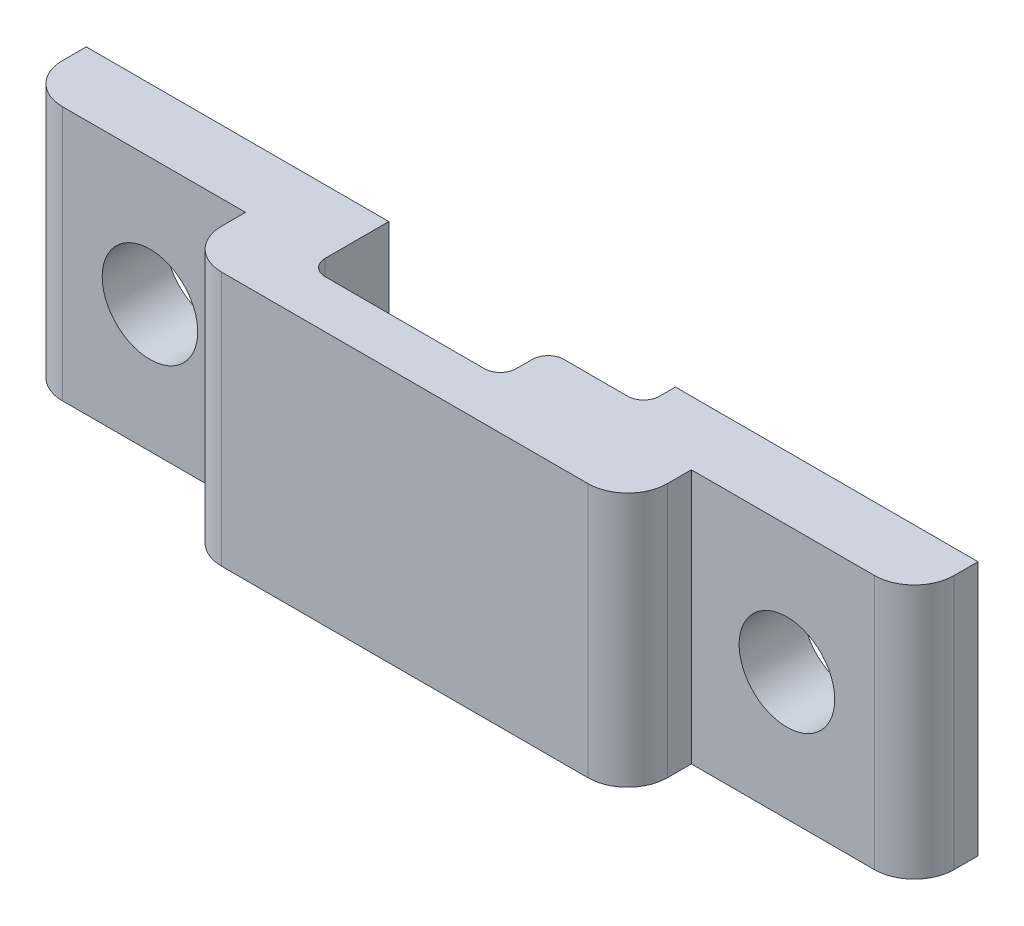
ISO-10303-21;
HEADER;
FILE_DESCRIPTION(('STEP AP214'),'2;1');
FILE_NAME('part.step','',(''),(''),'','','');
FILE_SCHEMA(('AUTOMOTIVE_DESIGN { 1 0 10303 214 1 1 1 1 }'));
ENDSEC;
DATA;
#1=APPLICATION_CONTEXT('core data for automotive mechanical design processes');
#2=APPLICATION_PROTOCOL_DEFINITION('international standard','automotive_design',2000,#1);
#3=PRODUCT_CONTEXT('',#1,'mechanical');
#4=PRODUCT('Part','Part','',(#3));
#5=PRODUCT_RELATED_PRODUCT_CATEGORY('part','',(#4));
#6=PRODUCT_DEFINITION_FORMATION('','',#4);
#7=PRODUCT_DEFINITION_CONTEXT('part definition',#1,'design');
#8=PRODUCT_DEFINITION('design','',#6,#7);
#9=PRODUCT_DEFINITION_SHAPE('','',#8);
#10=(LENGTH_UNIT() NAMED_UNIT(*) SI_UNIT(.MILLI.,.METRE.));
#11=(NAMED_UNIT(*) PLANE_ANGLE_UNIT() SI_UNIT($,.RADIAN.));
#12=(NAMED_UNIT(*) SI_UNIT($,.STERADIAN.) SOLID_ANGLE_UNIT());
#13=UNCERTAINTY_MEASURE_WITH_UNIT(LENGTH_MEASURE(1.E-05),#10,'distance_accuracy_value','');
#14=(GEOMETRIC_REPRESENTATION_CONTEXT(3) GLOBAL_UNCERTAINTY_ASSIGNED_CONTEXT((#13)) GLOBAL_UNIT_ASSIGNED_CONTEXT((#10,
#11,#12)) REPRESENTATION_CONTEXT('',''));
#15=CARTESIAN_POINT('',(0.,0.,0.));
#16=DIRECTION('',(0.,0.,1.));
#17=DIRECTION('',(1.,0.,0.));
#18=AXIS2_PLACEMENT_3D('',#15,#16,#17);
#19=CARTESIAN_POINT('',(0.,0.,5.08));
#20=DIRECTION('',(0.,0.,1.));
#21=DIRECTION('',(1.,0.,0.));
#22=AXIS2_PLACEMENT_3D('',#19,#20,#21);
#23=PLANE('',#22);
#24=DIRECTION('',(1.,0.,0.));
#25=VECTOR('',#24,1.);
#26=CARTESIAN_POINT('',(-17.78,-5.08,5.08));
#27=LINE('',#26,#25);
#28=CARTESIAN_POINT('',(-7.3025,-5.08,5.08));
#29=VERTEX_POINT('',#28);
#30=CARTESIAN_POINT('',(7.3025,-5.08,5.08));
#31=VERTEX_POINT('',#30);
#32=EDGE_CURVE('E296',#29,#31,#27,.T.);
#33=ORIENTED_EDGE('',*,*,#32,.T.);
#34=DIRECTION('',(0.,-1.,0.));
#35=VECTOR('',#34,1.);
#36=CARTESIAN_POINT('',(7.3025,5.08,5.08));
#37=LINE('',#36,#35);
#38=CARTESIAN_POINT('',(7.3025,5.08,5.08));
#39=VERTEX_POINT('',#38);
#40=EDGE_CURVE('E379',#31,#39,#37,.F.);
#41=ORIENTED_EDGE('',*,*,#40,.T.);
#42=DIRECTION('',(-1.,0.,0.));
#43=VECTOR('',#42,1.);
#44=CARTESIAN_POINT('',(-17.78,5.08,5.08));
#45=LINE('',#44,#43);
#46=CARTESIAN_POINT('',(-7.3025,5.08,5.08));
#47=VERTEX_POINT('',#46);
#48=EDGE_CURVE('E300',#39,#47,#45,.T.);
#49=ORIENTED_EDGE('',*,*,#48,.T.);
#50=DIRECTION('',(0.,-1.,0.));
#51=VECTOR('',#50,1.);
#52=CARTESIAN_POINT('',(-7.3025,0.,5.08));
#53=LINE('',#52,#51);
#54=EDGE_CURVE('E375',#47,#29,#53,.T.);
#55=ORIENTED_EDGE('',*,*,#54,.T.);
#56=EDGE_LOOP('',(#33,#41,#49,#55));
#57=FACE_BOUND('',#56,.T.);
#58=ADVANCED_FACE('F39',(#57),#23,.T.);
#59=CARTESIAN_POINT('',(0.,0.,0.));
#60=DIRECTION('',(0.,0.,1.));
#61=DIRECTION('',(1.,0.,0.));
#62=AXIS2_PLACEMENT_3D('',#59,#60,#61);
#63=PLANE('',#62);
#64=CARTESIAN_POINT('',(-12.7,0.,0.));
#65=DIRECTION('',(0.,0.,1.));
#66=DIRECTION('',(1.,0.,0.));
#67=AXIS2_PLACEMENT_3D('',#64,#65,#66);
#68=CIRCLE('',#67,1.905);
#69=CARTESIAN_POINT('',(-10.795,0.,0.));
#70=VERTEX_POINT('',#69);
#71=EDGE_CURVE('E291',#70,#70,#68,.T.);
#72=ORIENTED_EDGE('',*,*,#71,.T.);
#73=EDGE_LOOP('',(#72));
#74=FACE_BOUND('',#73,.T.);
#75=DIRECTION('',(0.,-1.,0.));
#76=VECTOR('',#75,1.);
#77=CARTESIAN_POINT('',(-5.715,5.08,0.));
#78=LINE('',#77,#76);
#79=CARTESIAN_POINT('',(-5.715,5.08,0.));
#80=VERTEX_POINT('',#79);
#81=CARTESIAN_POINT('',(-5.715,-5.08,0.));
#82=VERTEX_POINT('',#81);
#83=EDGE_CURVE('E227',#80,#82,#78,.T.);
#84=ORIENTED_EDGE('',*,*,#83,.T.);
#85=DIRECTION('',(1.,0.,0.));
#86=VECTOR('',#85,1.);
#87=CARTESIAN_POINT('',(-17.78,-5.08,0.));
#88=LINE('',#87,#86);
#89=CARTESIAN_POINT('',(-17.78,-5.08,0.));
#90=VERTEX_POINT('',#89);
#91=EDGE_CURVE('E310',#90,#82,#88,.T.);
#92=ORIENTED_EDGE('',*,*,#91,.F.);
#93=DIRECTION('',(0.,-1.,0.));
#94=VECTOR('',#93,1.);
#95=CARTESIAN_POINT('',(-17.78,5.08,0.));
#96=LINE('',#95,#94);
#97=CARTESIAN_POINT('',(-17.78,5.08,0.));
#98=VERTEX_POINT('',#97);
#99=EDGE_CURVE('E295',#98,#90,#96,.T.);
#100=ORIENTED_EDGE('',*,*,#99,.F.);
#101=DIRECTION('',(-1.,0.,0.));
#102=VECTOR('',#101,1.);
#103=CARTESIAN_POINT('',(-17.78,5.08,0.));
#104=LINE('',#103,#102);
#105=EDGE_CURVE('E318',#80,#98,#104,.T.);
#106=ORIENTED_EDGE('',*,*,#105,.F.);
#107=EDGE_LOOP('',(#84,#92,#100,#106));
#108=FACE_BOUND('',#107,.T.);
#109=ADVANCED_FACE('F446',(#74,#108),#63,.F.);
#110=CARTESIAN_POINT('',(12.7,0.,0.));
#111=DIRECTION('',(0.,0.,1.));
#112=DIRECTION('',(1.,0.,0.));
#113=AXIS2_PLACEMENT_3D('',#110,#111,#112);
#114=CIRCLE('',#113,1.905);
#115=CARTESIAN_POINT('',(14.605,0.,0.));
#116=VERTEX_POINT('',#115);
#117=EDGE_CURVE('E287',#116,#116,#114,.T.);
#118=ORIENTED_EDGE('',*,*,#117,.T.);
#119=EDGE_LOOP('',(#118));
#120=FACE_BOUND('',#119,.T.);
#121=DIRECTION('',(0.,-1.,0.));
#122=VECTOR('',#121,1.);
#123=CARTESIAN_POINT('',(5.715,5.08,0.));
#124=LINE('',#123,#122);
#125=CARTESIAN_POINT('',(5.715,5.08,0.));
#126=VERTEX_POINT('',#125);
#127=CARTESIAN_POINT('',(5.715,-5.08,0.));
#128=VERTEX_POINT('',#127);
#129=EDGE_CURVE('E231',#126,#128,#124,.T.);
#130=ORIENTED_EDGE('',*,*,#129,.F.);
#131=CARTESIAN_POINT('',(17.78,5.08,0.));
#132=VERTEX_POINT('',#131);
#133=EDGE_CURVE('E301',#132,#126,#104,.T.);
#134=ORIENTED_EDGE('',*,*,#133,.F.);
#135=DIRECTION('',(0.,1.,0.));
#136=VECTOR('',#135,1.);
#137=CARTESIAN_POINT('',(17.78,5.08,0.));
#138=LINE('',#137,#136);
#139=CARTESIAN_POINT('',(17.78,-5.08,0.));
#140=VERTEX_POINT('',#139);
#141=EDGE_CURVE('E314',#140,#132,#138,.T.);
#142=ORIENTED_EDGE('',*,*,#141,.F.);
#143=EDGE_CURVE('E309',#128,#140,#88,.T.);
#144=ORIENTED_EDGE('',*,*,#143,.F.);
#145=EDGE_LOOP('',(#130,#134,#142,#144));
#146=FACE_BOUND('',#145,.T.);
#147=ADVANCED_FACE('F458',(#120,#146),#63,.F.);
#148=CARTESIAN_POINT('',(-17.78,-5.08,5.08));
#149=DIRECTION('',(0.,1.,0.));
#150=DIRECTION('',(0.,0.,1.));
#151=AXIS2_PLACEMENT_3D('',#148,#149,#150);
#152=PLANE('',#151);
#153=DIRECTION('',(0.,0.,-1.));
#154=VECTOR('',#153,1.);
#155=CARTESIAN_POINT('',(1.905,-5.08,3.175));
#156=LINE('',#155,#154);
#157=CARTESIAN_POINT('',(1.905,-5.08,2.54));
#158=VERTEX_POINT('',#157);
#159=CARTESIAN_POINT('',(1.905,-5.08,1.905));
#160=VERTEX_POINT('',#159);
#161=EDGE_CURVE('E245',#158,#160,#156,.T.);
#162=ORIENTED_EDGE('',*,*,#161,.T.);
#163=CARTESIAN_POINT('',(2.54,-5.08,1.905));
#164=DIRECTION('',(0.,1.,0.));
#165=DIRECTION('',(0.,0.,1.));
#166=AXIS2_PLACEMENT_3D('',#163,#164,#165);
#167=CIRCLE('',#166,0.635);
#168=CARTESIAN_POINT('',(2.54,-5.08,1.27));
#169=VERTEX_POINT('',#168);
#170=EDGE_CURVE('E402',#160,#169,#167,.F.);
#171=ORIENTED_EDGE('',*,*,#170,.T.);
#172=DIRECTION('',(1.,0.,0.));
#173=VECTOR('',#172,1.);
#174=CARTESIAN_POINT('',(1.905,-5.08,1.27));
#175=LINE('',#174,#173);
#176=CARTESIAN_POINT('',(5.08,-5.08,1.27));
#177=VERTEX_POINT('',#176);
#178=EDGE_CURVE('E240',#169,#177,#175,.T.);
#179=ORIENTED_EDGE('',*,*,#178,.T.);
#180=CARTESIAN_POINT('',(5.08,-5.08,0.635));
#181=DIRECTION('',(0.,1.,0.));
#182=DIRECTION('',(0.,0.,1.));
#183=AXIS2_PLACEMENT_3D('',#180,#181,#182);
#184=CIRCLE('',#183,0.635);
#185=CARTESIAN_POINT('',(5.715,-5.08,0.635));
#186=VERTEX_POINT('',#185);
#187=EDGE_CURVE('E419',#177,#186,#184,.T.);
#188=ORIENTED_EDGE('',*,*,#187,.T.);
#189=DIRECTION('',(0.,0.,-1.));
#190=VECTOR('',#189,1.);
#191=CARTESIAN_POINT('',(5.715,-5.08,1.27));
#192=LINE('',#191,#190);
#193=EDGE_CURVE('E237',#186,#128,#192,.T.);
#194=ORIENTED_EDGE('',*,*,#193,.T.);
#195=ORIENTED_EDGE('',*,*,#143,.T.);
#196=DIRECTION('',(0.,0.,-1.));
#197=VECTOR('',#196,1.);
#198=CARTESIAN_POINT('',(17.78,-5.08,5.08));
#199=LINE('',#198,#197);
#200=CARTESIAN_POINT('',(17.78,-5.08,0.9525));
#201=VERTEX_POINT('',#200);
#202=EDGE_CURVE('E327',#201,#140,#199,.T.);
#203=ORIENTED_EDGE('',*,*,#202,.F.);
#204=CARTESIAN_POINT('',(16.1925,-5.08,0.9525));
#205=DIRECTION('',(0.,1.,0.));
#206=DIRECTION('',(0.,0.,1.));
#207=AXIS2_PLACEMENT_3D('',#204,#205,#206);
#208=CIRCLE('',#207,1.5875);
#209=CARTESIAN_POINT('',(16.1925,-5.08,2.54));
#210=VERTEX_POINT('',#209);
#211=EDGE_CURVE('E343',#201,#210,#208,.F.);
#212=ORIENTED_EDGE('',*,*,#211,.T.);
#213=DIRECTION('',(-1.,0.,0.));
#214=VECTOR('',#213,1.);
#215=CARTESIAN_POINT('',(17.78,-5.08,2.54));
#216=LINE('',#215,#214);
#217=CARTESIAN_POINT('',(8.89,-5.08,2.54));
#218=VERTEX_POINT('',#217);
#219=EDGE_CURVE('E275',#210,#218,#216,.T.);
#220=ORIENTED_EDGE('',*,*,#219,.T.);
#221=DIRECTION('',(0.,0.,-1.));
#222=VECTOR('',#221,1.);
#223=CARTESIAN_POINT('',(8.89,-5.08,5.08));
#224=LINE('',#223,#222);
#225=CARTESIAN_POINT('',(8.89,-5.08,3.4925));
#226=VERTEX_POINT('',#225);
#227=EDGE_CURVE('E232',#226,#218,#224,.T.);
#228=ORIENTED_EDGE('',*,*,#227,.F.);
#229=CARTESIAN_POINT('',(7.3025,-5.08,3.4925));
#230=DIRECTION('',(0.,1.,0.));
#231=DIRECTION('',(0.,0.,1.));
#232=AXIS2_PLACEMENT_3D('',#229,#230,#231);
#233=CIRCLE('',#232,1.5875);
#234=EDGE_CURVE('E340',#226,#31,#233,.F.);
#235=ORIENTED_EDGE('',*,*,#234,.T.);
#236=ORIENTED_EDGE('',*,*,#32,.F.);
#237=CARTESIAN_POINT('',(-7.3025,-5.08,3.4925));
#238=DIRECTION('',(0.,1.,0.));
#239=DIRECTION('',(0.,0.,1.));
#240=AXIS2_PLACEMENT_3D('',#237,#238,#239);
#241=CIRCLE('',#240,1.5875);
#242=CARTESIAN_POINT('',(-8.89,-5.08,3.4925));
#243=VERTEX_POINT('',#242);
#244=EDGE_CURVE('E195',#29,#243,#241,.F.);
#245=ORIENTED_EDGE('',*,*,#244,.T.);
#246=DIRECTION('',(0.,0.,-1.));
#247=VECTOR('',#246,1.);
#248=CARTESIAN_POINT('',(-8.89,-5.08,5.08));
#249=LINE('',#248,#247);
#250=CARTESIAN_POINT('',(-8.89,-5.08,2.54));
#251=VERTEX_POINT('',#250);
#252=EDGE_CURVE('E189',#243,#251,#249,.T.);
#253=ORIENTED_EDGE('',*,*,#252,.T.);
#254=DIRECTION('',(1.,0.,0.));
#255=VECTOR('',#254,1.);
#256=CARTESIAN_POINT('',(-17.78,-5.08,2.54));
#257=LINE('',#256,#255);
#258=CARTESIAN_POINT('',(-16.1925,-5.08,2.54));
#259=VERTEX_POINT('',#258);
#260=EDGE_CURVE('E193',#259,#251,#257,.T.);
#261=ORIENTED_EDGE('',*,*,#260,.F.);
#262=CARTESIAN_POINT('',(-16.1925,-5.08,0.9525));
#263=DIRECTION('',(0.,1.,0.));
#264=DIRECTION('',(0.,0.,1.));
#265=AXIS2_PLACEMENT_3D('',#262,#263,#264);
#266=CIRCLE('',#265,1.5875);
#267=CARTESIAN_POINT('',(-17.78,-5.08,0.9525));
#268=VERTEX_POINT('',#267);
#269=EDGE_CURVE('E346',#259,#268,#266,.F.);
#270=ORIENTED_EDGE('',*,*,#269,.T.);
#271=DIRECTION('',(0.,0.,-1.));
#272=VECTOR('',#271,1.);
#273=CARTESIAN_POINT('',(-17.78,-5.08,5.08));
#274=LINE('',#273,#272);
#275=EDGE_CURVE('E330',#268,#90,#274,.T.);
#276=ORIENTED_EDGE('',*,*,#275,.T.);
#277=ORIENTED_EDGE('',*,*,#91,.T.);
#278=DIRECTION('',(0.,0.,1.));
#279=VECTOR('',#278,1.);
#280=CARTESIAN_POINT('',(-5.715,-5.08,0.));
#281=LINE('',#280,#279);
#282=CARTESIAN_POINT('',(-5.715,-5.08,2.54));
#283=VERTEX_POINT('',#282);
#284=EDGE_CURVE('E211',#82,#283,#281,.T.);
#285=ORIENTED_EDGE('',*,*,#284,.T.);
#286=CARTESIAN_POINT('',(-5.08,-5.08,2.54));
#287=DIRECTION('',(0.,1.,0.));
#288=DIRECTION('',(0.,0.,1.));
#289=AXIS2_PLACEMENT_3D('',#286,#287,#288);
#290=CIRCLE('',#289,0.635);
#291=CARTESIAN_POINT('',(-5.08,-5.08,3.175));
#292=VERTEX_POINT('',#291);
#293=EDGE_CURVE('E48',#283,#292,#290,.T.);
#294=ORIENTED_EDGE('',*,*,#293,.T.);
#295=DIRECTION('',(1.,0.,0.));
#296=VECTOR('',#295,1.);
#297=CARTESIAN_POINT('',(-5.715,-5.08,3.175));
#298=LINE('',#297,#296);
#299=CARTESIAN_POINT('',(1.27,-5.08,3.175));
#300=VERTEX_POINT('',#299);
#301=EDGE_CURVE('E248',#292,#300,#298,.T.);
#302=ORIENTED_EDGE('',*,*,#301,.T.);
#303=CARTESIAN_POINT('',(1.27,-5.08,2.54));
#304=DIRECTION('',(0.,1.,0.));
#305=DIRECTION('',(0.,0.,1.));
#306=AXIS2_PLACEMENT_3D('',#303,#304,#305);
#307=CIRCLE('',#306,0.635);
#308=EDGE_CURVE('E425',#300,#158,#307,.T.);
#309=ORIENTED_EDGE('',*,*,#308,.T.);
#310=EDGE_LOOP('',(#162,#171,#179,#188,#194,#195,#203,#212,#220,#228,#235,#236,#245,#253,#261,
#270,#276,#277,#285,#294,#302,#309));
#311=FACE_BOUND('',#310,.T.);
#312=ADVANCED_FACE('F192',(#311),#152,.F.);
#313=CARTESIAN_POINT('',(17.78,5.08,5.08));
#314=DIRECTION('',(-1.,0.,0.));
#315=DIRECTION('',(0.,0.,1.));
#316=AXIS2_PLACEMENT_3D('',#313,#314,#315);
#317=PLANE('',#316);
#318=DIRECTION('',(0.,0.,-1.));
#319=VECTOR('',#318,1.);
#320=CARTESIAN_POINT('',(17.78,5.08,5.08));
#321=LINE('',#320,#319);
#322=CARTESIAN_POINT('',(17.78,5.08,0.9525));
#323=VERTEX_POINT('',#322);
#324=EDGE_CURVE('E324',#323,#132,#321,.T.);
#325=ORIENTED_EDGE('',*,*,#324,.F.);
#326=DIRECTION('',(0.,-1.,0.));
#327=VECTOR('',#326,1.);
#328=CARTESIAN_POINT('',(17.78,-5.08,0.9525));
#329=LINE('',#328,#327);
#330=EDGE_CURVE('E364',#323,#201,#329,.T.);
#331=ORIENTED_EDGE('',*,*,#330,.T.);
#332=ORIENTED_EDGE('',*,*,#202,.T.);
#333=ORIENTED_EDGE('',*,*,#141,.T.);
#334=EDGE_LOOP('',(#325,#331,#332,#333));
#335=FACE_BOUND('',#334,.T.);
#336=ADVANCED_FACE('F461',(#335),#317,.F.);
#337=CARTESIAN_POINT('',(-17.78,5.08,5.08));
#338=DIRECTION('',(0.,-1.,0.));
#339=DIRECTION('',(0.,0.,-1.));
#340=AXIS2_PLACEMENT_3D('',#337,#338,#339);
#341=PLANE('',#340);
#342=DIRECTION('',(1.,0.,0.));
#343=VECTOR('',#342,1.);
#344=CARTESIAN_POINT('',(1.905,5.08,1.27));
#345=LINE('',#344,#343);
#346=CARTESIAN_POINT('',(2.54,5.08,1.27));
#347=VERTEX_POINT('',#346);
#348=CARTESIAN_POINT('',(5.08,5.08,1.27));
#349=VERTEX_POINT('',#348);
#350=EDGE_CURVE('E257',#347,#349,#345,.T.);
#351=ORIENTED_EDGE('',*,*,#350,.F.);
#352=CARTESIAN_POINT('',(2.54,5.08,1.905));
#353=DIRECTION('',(0.,-1.,0.));
#354=DIRECTION('',(0.,0.,-1.));
#355=AXIS2_PLACEMENT_3D('',#352,#353,#354);
#356=CIRCLE('',#355,0.635);
#357=CARTESIAN_POINT('',(1.905,5.08,1.905));
#358=VERTEX_POINT('',#357);
#359=EDGE_CURVE('E405',#347,#358,#356,.F.);
#360=ORIENTED_EDGE('',*,*,#359,.T.);
#361=DIRECTION('',(0.,0.,-1.));
#362=VECTOR('',#361,1.);
#363=CARTESIAN_POINT('',(1.905,5.08,3.175));
#364=LINE('',#363,#362);
#365=CARTESIAN_POINT('',(1.905,5.08,2.54));
#366=VERTEX_POINT('',#365);
#367=EDGE_CURVE('E261',#366,#358,#364,.T.);
#368=ORIENTED_EDGE('',*,*,#367,.F.);
#369=CARTESIAN_POINT('',(1.27,5.08,2.54));
#370=DIRECTION('',(0.,-1.,0.));
#371=DIRECTION('',(0.,0.,-1.));
#372=AXIS2_PLACEMENT_3D('',#369,#370,#371);
#373=CIRCLE('',#372,0.635);
#374=CARTESIAN_POINT('',(1.27,5.08,3.175));
#375=VERTEX_POINT('',#374);
#376=EDGE_CURVE('E59',#366,#375,#373,.T.);
#377=ORIENTED_EDGE('',*,*,#376,.T.);
#378=DIRECTION('',(1.,0.,0.));
#379=VECTOR('',#378,1.);
#380=CARTESIAN_POINT('',(-5.715,5.08,3.175));
#381=LINE('',#380,#379);
#382=CARTESIAN_POINT('',(-5.08,5.08,3.175));
#383=VERTEX_POINT('',#382);
#384=EDGE_CURVE('E265',#383,#375,#381,.T.);
#385=ORIENTED_EDGE('',*,*,#384,.F.);
#386=CARTESIAN_POINT('',(-5.08,5.08,2.54));
#387=DIRECTION('',(0.,-1.,0.));
#388=DIRECTION('',(0.,0.,-1.));
#389=AXIS2_PLACEMENT_3D('',#386,#387,#388);
#390=CIRCLE('',#389,0.635);
#391=CARTESIAN_POINT('',(-5.715,5.08,2.54));
#392=VERTEX_POINT('',#391);
#393=EDGE_CURVE('E11',#383,#392,#390,.T.);
#394=ORIENTED_EDGE('',*,*,#393,.T.);
#395=DIRECTION('',(0.,0.,1.));
#396=VECTOR('',#395,1.);
#397=CARTESIAN_POINT('',(-5.715,5.08,0.));
#398=LINE('',#397,#396);
#399=EDGE_CURVE('E241',#80,#392,#398,.T.);
#400=ORIENTED_EDGE('',*,*,#399,.F.);
#401=ORIENTED_EDGE('',*,*,#105,.T.);
#402=DIRECTION('',(0.,0.,-1.));
#403=VECTOR('',#402,1.);
#404=CARTESIAN_POINT('',(-17.78,5.08,5.08));
#405=LINE('',#404,#403);
#406=CARTESIAN_POINT('',(-17.78,5.08,0.9525));
#407=VERTEX_POINT('',#406);
#408=EDGE_CURVE('E305',#407,#98,#405,.T.);
#409=ORIENTED_EDGE('',*,*,#408,.F.);
#410=CARTESIAN_POINT('',(-16.1925,5.08,0.9525));
#411=DIRECTION('',(0.,-1.,0.));
#412=DIRECTION('',(0.,0.,-1.));
#413=AXIS2_PLACEMENT_3D('',#410,#411,#412);
#414=CIRCLE('',#413,1.5875);
#415=CARTESIAN_POINT('',(-16.1925,5.08,2.54));
#416=VERTEX_POINT('',#415);
#417=EDGE_CURVE('E361',#407,#416,#414,.F.);
#418=ORIENTED_EDGE('',*,*,#417,.T.);
#419=DIRECTION('',(1.,0.,0.));
#420=VECTOR('',#419,1.);
#421=CARTESIAN_POINT('',(-17.78,5.08,2.54));
#422=LINE('',#421,#420);
#423=CARTESIAN_POINT('',(-8.89,5.08,2.54));
#424=VERTEX_POINT('',#423);
#425=EDGE_CURVE('E200',#416,#424,#422,.T.);
#426=ORIENTED_EDGE('',*,*,#425,.T.);
#427=DIRECTION('',(0.,0.,-1.));
#428=VECTOR('',#427,1.);
#429=CARTESIAN_POINT('',(-8.89,5.08,5.08));
#430=LINE('',#429,#428);
#431=CARTESIAN_POINT('',(-8.89,5.08,3.4925));
#432=VERTEX_POINT('',#431);
#433=EDGE_CURVE('E215',#432,#424,#430,.T.);
#434=ORIENTED_EDGE('',*,*,#433,.F.);
#435=CARTESIAN_POINT('',(-7.3025,5.08,3.4925));
#436=DIRECTION('',(0.,-1.,0.));
#437=DIRECTION('',(0.,0.,-1.));
#438=AXIS2_PLACEMENT_3D('',#435,#436,#437);
#439=CIRCLE('',#438,1.5875);
#440=EDGE_CURVE('E352',#432,#47,#439,.F.);
#441=ORIENTED_EDGE('',*,*,#440,.T.);
#442=ORIENTED_EDGE('',*,*,#48,.F.);
#443=CARTESIAN_POINT('',(7.3025,5.08,3.4925));
#444=DIRECTION('',(0.,-1.,0.));
#445=DIRECTION('',(0.,0.,-1.));
#446=AXIS2_PLACEMENT_3D('',#443,#444,#445);
#447=CIRCLE('',#446,1.5875);
#448=CARTESIAN_POINT('',(8.89,5.08,3.4925));
#449=VERTEX_POINT('',#448);
#450=EDGE_CURVE('E355',#39,#449,#447,.F.);
#451=ORIENTED_EDGE('',*,*,#450,.T.);
#452=DIRECTION('',(0.,0.,-1.));
#453=VECTOR('',#452,1.);
#454=CARTESIAN_POINT('',(8.89,5.08,5.08));
#455=LINE('',#454,#453);
#456=CARTESIAN_POINT('',(8.89,5.08,2.54));
#457=VERTEX_POINT('',#456);
#458=EDGE_CURVE('E279',#449,#457,#455,.T.);
#459=ORIENTED_EDGE('',*,*,#458,.T.);
#460=DIRECTION('',(-1.,0.,0.));
#461=VECTOR('',#460,1.);
#462=CARTESIAN_POINT('',(17.78,5.08,2.54));
#463=LINE('',#462,#461);
#464=CARTESIAN_POINT('',(16.1925,5.08,2.54));
#465=VERTEX_POINT('',#464);
#466=EDGE_CURVE('E274',#465,#457,#463,.T.);
#467=ORIENTED_EDGE('',*,*,#466,.F.);
#468=CARTESIAN_POINT('',(16.1925,5.08,0.9525));
#469=DIRECTION('',(0.,-1.,0.));
#470=DIRECTION('',(0.,0.,-1.));
#471=AXIS2_PLACEMENT_3D('',#468,#469,#470);
#472=CIRCLE('',#471,1.5875);
#473=EDGE_CURVE('E358',#465,#323,#472,.F.);
#474=ORIENTED_EDGE('',*,*,#473,.T.);
#475=ORIENTED_EDGE('',*,*,#324,.T.);
#476=ORIENTED_EDGE('',*,*,#133,.T.);
#477=DIRECTION('',(0.,0.,-1.));
#478=VECTOR('',#477,1.);
#479=CARTESIAN_POINT('',(5.715,5.08,1.27));
#480=LINE('',#479,#478);
#481=CARTESIAN_POINT('',(5.715,5.08,0.635));
#482=VERTEX_POINT('',#481);
#483=EDGE_CURVE('E236',#482,#126,#480,.T.);
#484=ORIENTED_EDGE('',*,*,#483,.F.);
#485=CARTESIAN_POINT('',(5.08,5.08,0.635));
#486=DIRECTION('',(0.,-1.,0.));
#487=DIRECTION('',(0.,0.,-1.));
#488=AXIS2_PLACEMENT_3D('',#485,#486,#487);
#489=CIRCLE('',#488,0.635);
#490=EDGE_CURVE('E422',#482,#349,#489,.T.);
#491=ORIENTED_EDGE('',*,*,#490,.T.);
#492=EDGE_LOOP('',(#351,#360,#368,#377,#385,#394,#400,#401,#409,#418,#426,#434,#441,#442,#451,
#459,#467,#474,#475,#476,#484,#491));
#493=FACE_BOUND('',#492,.T.);
#494=ADVANCED_FACE('F442',(#493),#341,.F.);
#495=CARTESIAN_POINT('',(12.7,0.,5.08));
#496=DIRECTION('',(0.,0.,-1.));
#497=DIRECTION('',(-1.,0.,0.));
#498=AXIS2_PLACEMENT_3D('',#495,#496,#497);
#499=CYLINDRICAL_SURFACE('',#498,1.905);
#500=ORIENTED_EDGE('',*,*,#117,.F.);
#501=EDGE_LOOP('',(#500));
#502=FACE_BOUND('',#501,.T.);
#503=CARTESIAN_POINT('',(12.7,0.,2.54));
#504=DIRECTION('',(0.,0.,1.));
#505=DIRECTION('',(1.,0.,0.));
#506=AXIS2_PLACEMENT_3D('',#503,#504,#505);
#507=CIRCLE('',#506,1.905);
#508=CARTESIAN_POINT('',(14.605,0.,2.54));
#509=VERTEX_POINT('',#508);
#510=EDGE_CURVE('E218',#509,#509,#507,.T.);
#511=ORIENTED_EDGE('',*,*,#510,.T.);
#512=EDGE_LOOP('',(#511));
#513=FACE_BOUND('',#512,.T.);
#514=ADVANCED_FACE('F498',(#502,#513),#499,.F.);
#515=CARTESIAN_POINT('',(-17.78,5.08,5.08));
#516=DIRECTION('',(1.,0.,0.));
#517=DIRECTION('',(0.,0.,-1.));
#518=AXIS2_PLACEMENT_3D('',#515,#516,#517);
#519=PLANE('',#518);
#520=ORIENTED_EDGE('',*,*,#275,.F.);
#521=DIRECTION('',(0.,-1.,0.));
#522=VECTOR('',#521,1.);
#523=CARTESIAN_POINT('',(-17.78,5.08,0.9525));
#524=LINE('',#523,#522);
#525=EDGE_CURVE('E349',#268,#407,#524,.F.);
#526=ORIENTED_EDGE('',*,*,#525,.T.);
#527=ORIENTED_EDGE('',*,*,#408,.T.);
#528=ORIENTED_EDGE('',*,*,#99,.T.);
#529=EDGE_LOOP('',(#520,#526,#527,#528));
#530=FACE_BOUND('',#529,.T.);
#531=ADVANCED_FACE('F495',(#530),#519,.F.);
#532=CARTESIAN_POINT('',(-12.7,0.,5.08));
#533=DIRECTION('',(0.,0.,-1.));
#534=DIRECTION('',(-1.,0.,0.));
#535=AXIS2_PLACEMENT_3D('',#532,#533,#534);
#536=CYLINDRICAL_SURFACE('',#535,1.905);
#537=CARTESIAN_POINT('',(-12.7,0.,2.54));
#538=DIRECTION('',(0.,0.,-1.));
#539=DIRECTION('',(-1.,0.,0.));
#540=AXIS2_PLACEMENT_3D('',#537,#538,#539);
#541=CIRCLE('',#540,1.905);
#542=CARTESIAN_POINT('',(-14.605,0.,2.54));
#543=VERTEX_POINT('',#542);
#544=EDGE_CURVE('E223',#543,#543,#541,.T.);
#545=ORIENTED_EDGE('',*,*,#544,.F.);
#546=EDGE_LOOP('',(#545));
#547=FACE_BOUND('',#546,.T.);
#548=ORIENTED_EDGE('',*,*,#71,.F.);
#549=EDGE_LOOP('',(#548));
#550=FACE_BOUND('',#549,.T.);
#551=ADVANCED_FACE('F497',(#547,#550),#536,.F.);
#552=CARTESIAN_POINT('',(17.78,5.08,2.54));
#553=DIRECTION('',(0.,0.,1.));
#554=DIRECTION('',(1.,0.,0.));
#555=AXIS2_PLACEMENT_3D('',#552,#553,#554);
#556=PLANE('',#555);
#557=ORIENTED_EDGE('',*,*,#510,.F.);
#558=EDGE_LOOP('',(#557));
#559=FACE_BOUND('',#558,.T.);
#560=ORIENTED_EDGE('',*,*,#219,.F.);
#561=DIRECTION('',(0.,-1.,0.));
#562=VECTOR('',#561,1.);
#563=CARTESIAN_POINT('',(16.1925,5.08,2.54));
#564=LINE('',#563,#562);
#565=EDGE_CURVE('E368',#210,#465,#564,.F.);
#566=ORIENTED_EDGE('',*,*,#565,.T.);
#567=ORIENTED_EDGE('',*,*,#466,.T.);
#568=DIRECTION('',(0.,-1.,0.));
#569=VECTOR('',#568,1.);
#570=CARTESIAN_POINT('',(8.89,5.08,2.54));
#571=LINE('',#570,#569);
#572=EDGE_CURVE('E270',#457,#218,#571,.T.);
#573=ORIENTED_EDGE('',*,*,#572,.T.);
#574=EDGE_LOOP('',(#560,#566,#567,#573));
#575=FACE_BOUND('',#574,.T.);
#576=ADVANCED_FACE('F470',(#559,#575),#556,.T.);
#577=CARTESIAN_POINT('',(8.89,5.08,5.08));
#578=DIRECTION('',(-1.,0.,0.));
#579=DIRECTION('',(0.,0.,1.));
#580=AXIS2_PLACEMENT_3D('',#577,#578,#579);
#581=PLANE('',#580);
#582=ORIENTED_EDGE('',*,*,#458,.F.);
#583=DIRECTION('',(0.,-1.,0.));
#584=VECTOR('',#583,1.);
#585=CARTESIAN_POINT('',(8.89,-5.08,3.4925));
#586=LINE('',#585,#584);
#587=EDGE_CURVE('E371',#449,#226,#586,.T.);
#588=ORIENTED_EDGE('',*,*,#587,.T.);
#589=ORIENTED_EDGE('',*,*,#227,.T.);
#590=ORIENTED_EDGE('',*,*,#572,.F.);
#591=EDGE_LOOP('',(#582,#588,#589,#590));
#592=FACE_BOUND('',#591,.T.);
#593=ADVANCED_FACE('F475',(#592),#581,.F.);
#594=CARTESIAN_POINT('',(-8.89,5.08,5.08));
#595=DIRECTION('',(-1.,0.,0.));
#596=DIRECTION('',(0.,0.,1.));
#597=AXIS2_PLACEMENT_3D('',#594,#595,#596);
#598=PLANE('',#597);
#599=ORIENTED_EDGE('',*,*,#252,.F.);
#600=DIRECTION('',(0.,-1.,0.));
#601=VECTOR('',#600,1.);
#602=CARTESIAN_POINT('',(-8.89,5.08,3.4925));
#603=LINE('',#602,#601);
#604=EDGE_CURVE('E382',#243,#432,#603,.F.);
#605=ORIENTED_EDGE('',*,*,#604,.T.);
#606=ORIENTED_EDGE('',*,*,#433,.T.);
#607=DIRECTION('',(0.,-1.,0.));
#608=VECTOR('',#607,1.);
#609=CARTESIAN_POINT('',(-8.89,5.08,2.54));
#610=LINE('',#609,#608);
#611=EDGE_CURVE('E207',#424,#251,#610,.T.);
#612=ORIENTED_EDGE('',*,*,#611,.T.);
#613=EDGE_LOOP('',(#599,#605,#606,#612));
#614=FACE_BOUND('',#613,.T.);
#615=ADVANCED_FACE('F213',(#614),#598,.T.);
#616=CARTESIAN_POINT('',(-17.78,5.08,2.54));
#617=DIRECTION('',(0.,0.,-1.));
#618=DIRECTION('',(-1.,0.,0.));
#619=AXIS2_PLACEMENT_3D('',#616,#617,#618);
#620=PLANE('',#619);
#621=ORIENTED_EDGE('',*,*,#544,.T.);
#622=EDGE_LOOP('',(#621));
#623=FACE_BOUND('',#622,.T.);
#624=ORIENTED_EDGE('',*,*,#425,.F.);
#625=DIRECTION('',(0.,-1.,0.));
#626=VECTOR('',#625,1.);
#627=CARTESIAN_POINT('',(-16.1925,5.08,2.54));
#628=LINE('',#627,#626);
#629=EDGE_CURVE('E209',#416,#259,#628,.T.);
#630=ORIENTED_EDGE('',*,*,#629,.T.);
#631=ORIENTED_EDGE('',*,*,#260,.T.);
#632=ORIENTED_EDGE('',*,*,#611,.F.);
#633=EDGE_LOOP('',(#624,#630,#631,#632));
#634=FACE_BOUND('',#633,.T.);
#635=ADVANCED_FACE('F206',(#623,#634),#620,.F.);
#636=CARTESIAN_POINT('',(-5.715,5.08,0.));
#637=DIRECTION('',(1.,0.,0.));
#638=DIRECTION('',(0.,0.,-1.));
#639=AXIS2_PLACEMENT_3D('',#636,#637,#638);
#640=PLANE('',#639);
#641=ORIENTED_EDGE('',*,*,#399,.T.);
#642=DIRECTION('',(0.,-1.,0.));
#643=VECTOR('',#642,1.);
#644=CARTESIAN_POINT('',(-5.715,-5.08,2.54));
#645=LINE('',#644,#643);
#646=EDGE_CURVE('E415',#392,#283,#645,.T.);
#647=ORIENTED_EDGE('',*,*,#646,.T.);
#648=ORIENTED_EDGE('',*,*,#284,.F.);
#649=ORIENTED_EDGE('',*,*,#83,.F.);
#650=EDGE_LOOP('',(#641,#647,#648,#649));
#651=FACE_BOUND('',#650,.T.);
#652=ADVANCED_FACE('F438',(#651),#640,.T.);
#653=CARTESIAN_POINT('',(-5.715,5.08,3.175));
#654=DIRECTION('',(0.,0.,-1.));
#655=DIRECTION('',(-1.,0.,0.));
#656=AXIS2_PLACEMENT_3D('',#653,#654,#655);
#657=PLANE('',#656);
#658=ORIENTED_EDGE('',*,*,#384,.T.);
#659=DIRECTION('',(0.,-1.,0.));
#660=VECTOR('',#659,1.);
#661=CARTESIAN_POINT('',(1.27,-5.08,3.175));
#662=LINE('',#661,#660);
#663=EDGE_CURVE('E411',#375,#300,#662,.T.);
#664=ORIENTED_EDGE('',*,*,#663,.T.);
#665=ORIENTED_EDGE('',*,*,#301,.F.);
#666=DIRECTION('',(0.,-1.,0.));
#667=VECTOR('',#666,1.);
#668=CARTESIAN_POINT('',(-5.08,5.08,3.175));
#669=LINE('',#668,#667);
#670=EDGE_CURVE('E408',#292,#383,#669,.F.);
#671=ORIENTED_EDGE('',*,*,#670,.T.);
#672=EDGE_LOOP('',(#658,#664,#665,#671));
#673=FACE_BOUND('',#672,.T.);
#674=ADVANCED_FACE('F435',(#673),#657,.T.);
#675=CARTESIAN_POINT('',(1.905,5.08,3.175));
#676=DIRECTION('',(-1.,0.,0.));
#677=DIRECTION('',(0.,0.,1.));
#678=AXIS2_PLACEMENT_3D('',#675,#676,#677);
#679=PLANE('',#678);
#680=ORIENTED_EDGE('',*,*,#367,.T.);
#681=DIRECTION('',(0.,-1.,0.));
#682=VECTOR('',#681,1.);
#683=CARTESIAN_POINT('',(1.905,5.08,1.905));
#684=LINE('',#683,#682);
#685=EDGE_CURVE('E398',#358,#160,#684,.T.);
#686=ORIENTED_EDGE('',*,*,#685,.T.);
#687=ORIENTED_EDGE('',*,*,#161,.F.);
#688=DIRECTION('',(0.,-1.,0.));
#689=VECTOR('',#688,1.);
#690=CARTESIAN_POINT('',(1.905,5.08,2.54));
#691=LINE('',#690,#689);
#692=EDGE_CURVE('E395',#158,#366,#691,.F.);
#693=ORIENTED_EDGE('',*,*,#692,.T.);
#694=EDGE_LOOP('',(#680,#686,#687,#693));
#695=FACE_BOUND('',#694,.T.);
#696=ADVANCED_FACE('F546',(#695),#679,.T.);
#697=CARTESIAN_POINT('',(1.905,5.08,1.27));
#698=DIRECTION('',(0.,0.,-1.));
#699=DIRECTION('',(-1.,0.,0.));
#700=AXIS2_PLACEMENT_3D('',#697,#698,#699);
#701=PLANE('',#700);
#702=ORIENTED_EDGE('',*,*,#350,.T.);
#703=DIRECTION('',(0.,-1.,0.));
#704=VECTOR('',#703,1.);
#705=CARTESIAN_POINT('',(5.08,-5.08,1.27));
#706=LINE('',#705,#704);
#707=EDGE_CURVE('E388',#349,#177,#706,.T.);
#708=ORIENTED_EDGE('',*,*,#707,.T.);
#709=ORIENTED_EDGE('',*,*,#178,.F.);
#710=DIRECTION('',(0.,-1.,0.));
#711=VECTOR('',#710,1.);
#712=CARTESIAN_POINT('',(2.54,5.08,1.27));
#713=LINE('',#712,#711);
#714=EDGE_CURVE('E385',#169,#347,#713,.F.);
#715=ORIENTED_EDGE('',*,*,#714,.T.);
#716=EDGE_LOOP('',(#702,#708,#709,#715));
#717=FACE_BOUND('',#716,.T.);
#718=ADVANCED_FACE('F542',(#717),#701,.T.);
#719=CARTESIAN_POINT('',(5.715,5.08,1.27));
#720=DIRECTION('',(-1.,0.,0.));
#721=DIRECTION('',(0.,0.,1.));
#722=AXIS2_PLACEMENT_3D('',#719,#720,#721);
#723=PLANE('',#722);
#724=ORIENTED_EDGE('',*,*,#193,.F.);
#725=DIRECTION('',(0.,-1.,0.));
#726=VECTOR('',#725,1.);
#727=CARTESIAN_POINT('',(5.715,5.08,0.635));
#728=LINE('',#727,#726);
#729=EDGE_CURVE('E392',#186,#482,#728,.F.);
#730=ORIENTED_EDGE('',*,*,#729,.T.);
#731=ORIENTED_EDGE('',*,*,#483,.T.);
#732=ORIENTED_EDGE('',*,*,#129,.T.);
#733=EDGE_LOOP('',(#724,#730,#731,#732));
#734=FACE_BOUND('',#733,.T.);
#735=ADVANCED_FACE('F539',(#734),#723,.T.);
#736=CARTESIAN_POINT('',(-16.1925,5.08,0.9525));
#737=DIRECTION('',(0.,-1.,0.));
#738=DIRECTION('',(0.,0.,-1.));
#739=AXIS2_PLACEMENT_3D('',#736,#737,#738);
#740=CYLINDRICAL_SURFACE('',#739,1.5875);
#741=ORIENTED_EDGE('',*,*,#417,.F.);
#742=ORIENTED_EDGE('',*,*,#525,.F.);
#743=ORIENTED_EDGE('',*,*,#269,.F.);
#744=ORIENTED_EDGE('',*,*,#629,.F.);
#745=EDGE_LOOP('',(#741,#742,#743,#744));
#746=FACE_BOUND('',#745,.T.);
#747=ADVANCED_FACE('F491',(#746),#740,.T.);
#748=CARTESIAN_POINT('',(16.1925,5.08,0.9525));
#749=DIRECTION('',(0.,1.,0.));
#750=DIRECTION('',(0.,0.,1.));
#751=AXIS2_PLACEMENT_3D('',#748,#749,#750);
#752=CYLINDRICAL_SURFACE('',#751,1.5875);
#753=ORIENTED_EDGE('',*,*,#473,.F.);
#754=ORIENTED_EDGE('',*,*,#565,.F.);
#755=ORIENTED_EDGE('',*,*,#211,.F.);
#756=ORIENTED_EDGE('',*,*,#330,.F.);
#757=EDGE_LOOP('',(#753,#754,#755,#756));
#758=FACE_BOUND('',#757,.T.);
#759=ADVANCED_FACE('F465',(#758),#752,.T.);
#760=CARTESIAN_POINT('',(7.3025,5.08,3.4925));
#761=DIRECTION('',(0.,1.,0.));
#762=DIRECTION('',(0.,0.,1.));
#763=AXIS2_PLACEMENT_3D('',#760,#761,#762);
#764=CYLINDRICAL_SURFACE('',#763,1.5875);
#765=ORIENTED_EDGE('',*,*,#450,.F.);
#766=ORIENTED_EDGE('',*,*,#40,.F.);
#767=ORIENTED_EDGE('',*,*,#234,.F.);
#768=ORIENTED_EDGE('',*,*,#587,.F.);
#769=EDGE_LOOP('',(#765,#766,#767,#768));
#770=FACE_BOUND('',#769,.T.);
#771=ADVANCED_FACE('F483',(#770),#764,.T.);
#772=CARTESIAN_POINT('',(-7.3025,0.,3.4925));
#773=DIRECTION('',(0.,-1.,0.));
#774=DIRECTION('',(0.,0.,-1.));
#775=AXIS2_PLACEMENT_3D('',#772,#773,#774);
#776=CYLINDRICAL_SURFACE('',#775,1.5875);
#777=ORIENTED_EDGE('',*,*,#440,.F.);
#778=ORIENTED_EDGE('',*,*,#604,.F.);
#779=ORIENTED_EDGE('',*,*,#244,.F.);
#780=ORIENTED_EDGE('',*,*,#54,.F.);
#781=EDGE_LOOP('',(#777,#778,#779,#780));
#782=FACE_BOUND('',#781,.T.);
#783=ADVANCED_FACE('F486',(#782),#776,.T.);
#784=CARTESIAN_POINT('',(5.08,5.08,0.635));
#785=DIRECTION('',(0.,1.,0.));
#786=DIRECTION('',(0.,0.,1.));
#787=AXIS2_PLACEMENT_3D('',#784,#785,#786);
#788=CYLINDRICAL_SURFACE('',#787,0.635);
#789=ORIENTED_EDGE('',*,*,#490,.F.);
#790=ORIENTED_EDGE('',*,*,#729,.F.);
#791=ORIENTED_EDGE('',*,*,#187,.F.);
#792=ORIENTED_EDGE('',*,*,#707,.F.);
#793=EDGE_LOOP('',(#789,#790,#791,#792));
#794=FACE_BOUND('',#793,.T.);
#795=ADVANCED_FACE('F612',(#794),#788,.F.);
#796=CARTESIAN_POINT('',(2.54,5.08,1.905));
#797=DIRECTION('',(0.,-1.,0.));
#798=DIRECTION('',(0.,0.,-1.));
#799=AXIS2_PLACEMENT_3D('',#796,#797,#798);
#800=CYLINDRICAL_SURFACE('',#799,0.635);
#801=ORIENTED_EDGE('',*,*,#359,.F.);
#802=ORIENTED_EDGE('',*,*,#714,.F.);
#803=ORIENTED_EDGE('',*,*,#170,.F.);
#804=ORIENTED_EDGE('',*,*,#685,.F.);
#805=EDGE_LOOP('',(#801,#802,#803,#804));
#806=FACE_BOUND('',#805,.T.);
#807=ADVANCED_FACE('F618',(#806),#800,.T.);
#808=CARTESIAN_POINT('',(1.27,5.08,2.54));
#809=DIRECTION('',(0.,1.,0.));
#810=DIRECTION('',(0.,0.,1.));
#811=AXIS2_PLACEMENT_3D('',#808,#809,#810);
#812=CYLINDRICAL_SURFACE('',#811,0.635);
#813=ORIENTED_EDGE('',*,*,#376,.F.);
#814=ORIENTED_EDGE('',*,*,#692,.F.);
#815=ORIENTED_EDGE('',*,*,#308,.F.);
#816=ORIENTED_EDGE('',*,*,#663,.F.);
#817=EDGE_LOOP('',(#813,#814,#815,#816));
#818=FACE_BOUND('',#817,.T.);
#819=ADVANCED_FACE('F626',(#818),#812,.F.);
#820=CARTESIAN_POINT('',(-5.08,5.08,2.54));
#821=DIRECTION('',(0.,1.,0.));
#822=DIRECTION('',(0.,0.,1.));
#823=AXIS2_PLACEMENT_3D('',#820,#821,#822);
#824=CYLINDRICAL_SURFACE('',#823,0.635);
#825=ORIENTED_EDGE('',*,*,#393,.F.);
#826=ORIENTED_EDGE('',*,*,#670,.F.);
#827=ORIENTED_EDGE('',*,*,#293,.F.);
#828=ORIENTED_EDGE('',*,*,#646,.F.);
#829=EDGE_LOOP('',(#825,#826,#827,#828));
#830=FACE_BOUND('',#829,.T.);
#831=ADVANCED_FACE('F41',(#830),#824,.F.);
#832=CLOSED_SHELL('',(#58,#109,#147,#312,#336,#494,#514,#531,#551,#576,#593,#615,#635,#652,#674,
#696,#718,#735,#747,#759,#771,#783,#795,#807,#819,#831));
#833=MANIFOLD_SOLID_BREP('B2',#832);
#834=ADVANCED_BREP_SHAPE_REPRESENTATION('',(#18,#833),#14);
#835=SHAPE_DEFINITION_REPRESENTATION(#9,#834);
ENDSEC;
END-ISO-10303-21;
